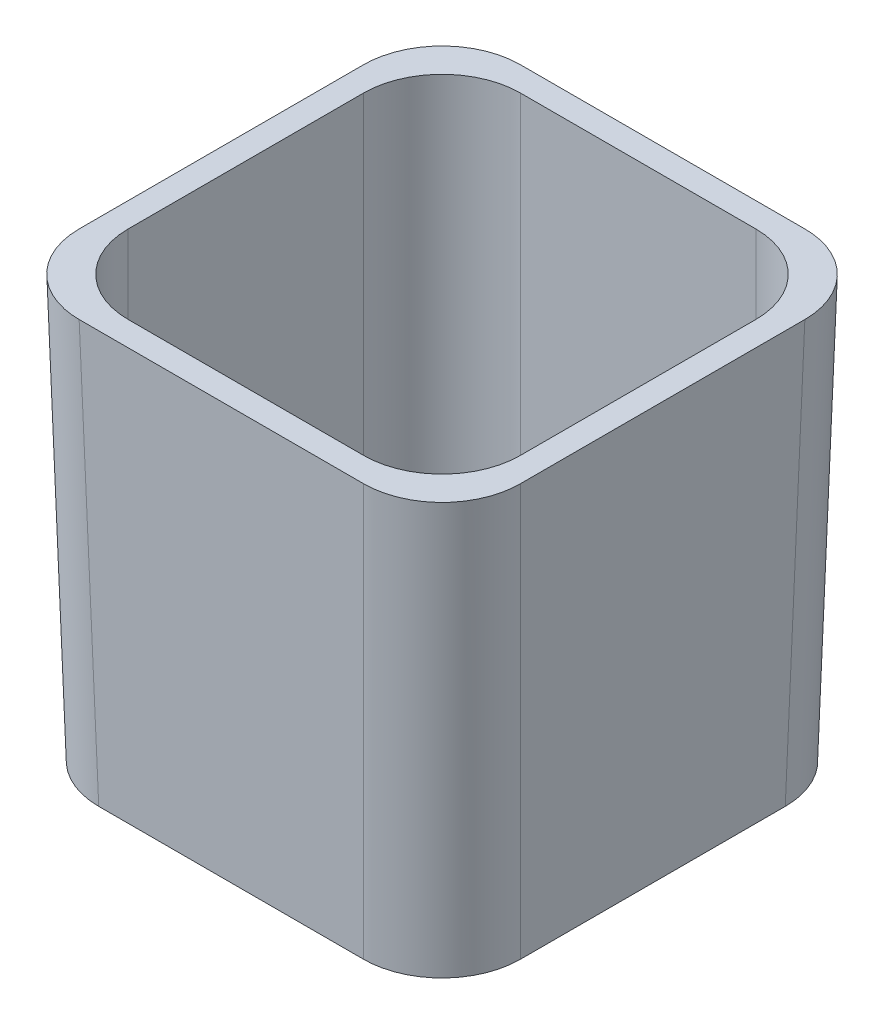
ISO-10303-21;
HEADER;
FILE_DESCRIPTION(('STEP AP214'),'2;1');
FILE_NAME('part.step','',(''),(''),'','','');
FILE_SCHEMA(('AUTOMOTIVE_DESIGN { 1 0 10303 214 1 1 1 1 }'));
ENDSEC;
DATA;
#1=APPLICATION_CONTEXT('core data for automotive mechanical design processes');
#2=APPLICATION_PROTOCOL_DEFINITION('international standard','automotive_design',2000,#1);
#3=PRODUCT_CONTEXT('',#1,'mechanical');
#4=PRODUCT('Part','Part','',(#3));
#5=PRODUCT_RELATED_PRODUCT_CATEGORY('part','',(#4));
#6=PRODUCT_DEFINITION_FORMATION('','',#4);
#7=PRODUCT_DEFINITION_CONTEXT('part definition',#1,'design');
#8=PRODUCT_DEFINITION('design','',#6,#7);
#9=PRODUCT_DEFINITION_SHAPE('','',#8);
#10=(LENGTH_UNIT() NAMED_UNIT(*) SI_UNIT(.MILLI.,.METRE.));
#11=(NAMED_UNIT(*) PLANE_ANGLE_UNIT() SI_UNIT($,.RADIAN.));
#12=(NAMED_UNIT(*) SI_UNIT($,.STERADIAN.) SOLID_ANGLE_UNIT());
#13=UNCERTAINTY_MEASURE_WITH_UNIT(LENGTH_MEASURE(1.E-05),#10,'distance_accuracy_value','');
#14=(GEOMETRIC_REPRESENTATION_CONTEXT(3) GLOBAL_UNCERTAINTY_ASSIGNED_CONTEXT((#13)) GLOBAL_UNIT_ASSIGNED_CONTEXT((#10,
#11,#12)) REPRESENTATION_CONTEXT('',''));
#15=CARTESIAN_POINT('',(0.,0.,0.));
#16=DIRECTION('',(0.,0.,1.));
#17=DIRECTION('',(1.,0.,0.));
#18=AXIS2_PLACEMENT_3D('',#15,#16,#17);
#19=CARTESIAN_POINT('',(0.,0.,0.));
#20=DIRECTION('',(0.,-1.,0.));
#21=DIRECTION('',(0.,0.,-1.));
#22=AXIS2_PLACEMENT_3D('',#19,#20,#21);
#23=PLANE('',#22);
#24=DIRECTION('',(-1.,0.,0.));
#25=VECTOR('',#24,1.);
#26=CARTESIAN_POINT('',(0.,0.,-86.));
#27=LINE('',#26,#25);
#28=CARTESIAN_POINT('',(70.0043249088505,0.,-86.));
#29=VERTEX_POINT('',#28);
#30=CARTESIAN_POINT('',(15.9956750911495,0.,-86.));
#31=VERTEX_POINT('',#30);
#32=EDGE_CURVE('E195',#29,#31,#27,.T.);
#33=ORIENTED_EDGE('',*,*,#32,.F.);
#34=CARTESIAN_POINT('',(69.9956739217812,0.,-69.9956739217811));
#35=DIRECTION('',(0.,-1.,0.));
#36=DIRECTION('',(-0.707106781186552,0.,0.707106781186543));
#37=AXIS2_PLACEMENT_3D('',#34,#35,#36);
#38=ELLIPSE('',#37,16.0086509873853,16.);
#39=CARTESIAN_POINT('',(86.,0.,-70.0043249088505));
#40=VERTEX_POINT('',#39);
#41=EDGE_CURVE('E177',#29,#40,#38,.T.);
#42=ORIENTED_EDGE('',*,*,#41,.T.);
#43=DIRECTION('',(0.,0.,-1.));
#44=VECTOR('',#43,1.);
#45=CARTESIAN_POINT('',(86.,0.,0.));
#46=LINE('',#45,#44);
#47=CARTESIAN_POINT('',(86.,0.,-15.9956750911495));
#48=VERTEX_POINT('',#47);
#49=EDGE_CURVE('E208',#48,#40,#46,.T.);
#50=ORIENTED_EDGE('',*,*,#49,.F.);
#51=CARTESIAN_POINT('',(69.9956739217812,0.,-16.0043260782188));
#52=DIRECTION('',(0.,-1.,0.));
#53=DIRECTION('',(-0.707106781186545,0.,-0.70710678118655));
#54=AXIS2_PLACEMENT_3D('',#51,#52,#53);
#55=ELLIPSE('',#54,16.0086509873853,16.);
#56=CARTESIAN_POINT('',(70.0043249088505,0.,0.));
#57=VERTEX_POINT('',#56);
#58=EDGE_CURVE('E189',#48,#57,#55,.T.);
#59=ORIENTED_EDGE('',*,*,#58,.T.);
#60=DIRECTION('',(1.,0.,0.));
#61=VECTOR('',#60,1.);
#62=CARTESIAN_POINT('',(0.,0.,0.));
#63=LINE('',#62,#61);
#64=CARTESIAN_POINT('',(15.9956750911495,0.,0.));
#65=VERTEX_POINT('',#64);
#66=EDGE_CURVE('E265',#65,#57,#63,.T.);
#67=ORIENTED_EDGE('',*,*,#66,.F.);
#68=CARTESIAN_POINT('',(16.0043260782188,0.,-16.0043260782188));
#69=DIRECTION('',(0.,-1.,0.));
#70=DIRECTION('',(0.707106781186542,0.,-0.707106781186553));
#71=AXIS2_PLACEMENT_3D('',#68,#69,#70);
#72=ELLIPSE('',#71,16.0086509873853,16.);
#73=CARTESIAN_POINT('',(0.,0.,-15.9956750911495));
#74=VERTEX_POINT('',#73);
#75=EDGE_CURVE('E530',#65,#74,#72,.T.);
#76=ORIENTED_EDGE('',*,*,#75,.T.);
#77=DIRECTION('',(0.,0.,1.));
#78=VECTOR('',#77,1.);
#79=CARTESIAN_POINT('',(0.,0.,0.));
#80=LINE('',#79,#78);
#81=CARTESIAN_POINT('',(0.,0.,-70.0043249088505));
#82=VERTEX_POINT('',#81);
#83=EDGE_CURVE('E209',#82,#74,#80,.T.);
#84=ORIENTED_EDGE('',*,*,#83,.F.);
#85=CARTESIAN_POINT('',(16.0043260782188,0.,-69.9956739217812));
#86=DIRECTION('',(0.,-1.,0.));
#87=DIRECTION('',(0.707106781186549,0.,0.707106781186546));
#88=AXIS2_PLACEMENT_3D('',#85,#86,#87);
#89=ELLIPSE('',#88,16.0086509873853,16.);
#90=EDGE_CURVE('E202',#82,#31,#89,.T.);
#91=ORIENTED_EDGE('',*,*,#90,.T.);
#92=EDGE_LOOP('',(#33,#42,#50,#59,#67,#76,#84,#91));
#93=FACE_BOUND('',#92,.T.);
#94=ADVANCED_FACE('F59',(#93),#23,.T.);
#95=CARTESIAN_POINT('',(0.,86.,0.));
#96=DIRECTION('',(0.,1.,0.));
#97=DIRECTION('',(0.,0.,1.));
#98=AXIS2_PLACEMENT_3D('',#95,#96,#97);
#99=PLANE('',#98);
#100=DIRECTION('',(-1.,0.,0.));
#101=VECTOR('',#100,1.);
#102=CARTESIAN_POINT('',(83.,86.,-83.));
#103=LINE('',#102,#101);
#104=CARTESIAN_POINT('',(67.,86.,-83.));
#105=VERTEX_POINT('',#104);
#106=CARTESIAN_POINT('',(19.,86.,-83.));
#107=VERTEX_POINT('',#106);
#108=EDGE_CURVE('E404',#105,#107,#103,.T.);
#109=ORIENTED_EDGE('',*,*,#108,.F.);
#110=CARTESIAN_POINT('',(67.,86.,-67.));
#111=DIRECTION('',(0.,1.,0.));
#112=DIRECTION('',(0.,0.,1.));
#113=AXIS2_PLACEMENT_3D('',#110,#111,#112);
#114=CIRCLE('',#113,16.);
#115=CARTESIAN_POINT('',(83.,86.,-67.));
#116=VERTEX_POINT('',#115);
#117=EDGE_CURVE('E519',#105,#116,#114,.F.);
#118=ORIENTED_EDGE('',*,*,#117,.T.);
#119=DIRECTION('',(0.,0.,-1.));
#120=VECTOR('',#119,1.);
#121=CARTESIAN_POINT('',(83.,86.,-83.));
#122=LINE('',#121,#120);
#123=CARTESIAN_POINT('',(83.,86.,-19.));
#124=VERTEX_POINT('',#123);
#125=EDGE_CURVE('E415',#124,#116,#122,.T.);
#126=ORIENTED_EDGE('',*,*,#125,.F.);
#127=CARTESIAN_POINT('',(67.,86.,-19.));
#128=DIRECTION('',(0.,1.,0.));
#129=DIRECTION('',(0.,0.,1.));
#130=AXIS2_PLACEMENT_3D('',#127,#128,#129);
#131=CIRCLE('',#130,16.);
#132=CARTESIAN_POINT('',(67.,86.,-2.99999999999999));
#133=VERTEX_POINT('',#132);
#134=EDGE_CURVE('E522',#124,#133,#131,.F.);
#135=ORIENTED_EDGE('',*,*,#134,.T.);
#136=DIRECTION('',(1.,0.,0.));
#137=VECTOR('',#136,1.);
#138=CARTESIAN_POINT('',(83.,86.,-2.99999999999999));
#139=LINE('',#138,#137);
#140=CARTESIAN_POINT('',(19.,86.,-2.99999999999998));
#141=VERTEX_POINT('',#140);
#142=EDGE_CURVE('E412',#141,#133,#139,.T.);
#143=ORIENTED_EDGE('',*,*,#142,.F.);
#144=CARTESIAN_POINT('',(19.,86.,-19.));
#145=DIRECTION('',(0.,1.,0.));
#146=DIRECTION('',(0.,0.,1.));
#147=AXIS2_PLACEMENT_3D('',#144,#145,#146);
#148=CIRCLE('',#147,16.);
#149=CARTESIAN_POINT('',(2.99999999999999,86.,-19.));
#150=VERTEX_POINT('',#149);
#151=EDGE_CURVE('E70',#141,#150,#148,.F.);
#152=ORIENTED_EDGE('',*,*,#151,.T.);
#153=DIRECTION('',(0.,0.,1.));
#154=VECTOR('',#153,1.);
#155=CARTESIAN_POINT('',(2.99999999999999,86.,-83.));
#156=LINE('',#155,#154);
#157=CARTESIAN_POINT('',(2.99999999999999,86.,-67.));
#158=VERTEX_POINT('',#157);
#159=EDGE_CURVE('E408',#158,#150,#156,.T.);
#160=ORIENTED_EDGE('',*,*,#159,.F.);
#161=CARTESIAN_POINT('',(19.,86.,-67.));
#162=DIRECTION('',(0.,1.,0.));
#163=DIRECTION('',(0.,0.,1.));
#164=AXIS2_PLACEMENT_3D('',#161,#162,#163);
#165=CIRCLE('',#164,16.);
#166=EDGE_CURVE('E12',#158,#107,#165,.F.);
#167=ORIENTED_EDGE('',*,*,#166,.T.);
#168=EDGE_LOOP('',(#109,#118,#126,#135,#143,#152,#160,#167));
#169=FACE_BOUND('',#168,.T.);
#170=DIRECTION('',(0.,0.,-1.));
#171=VECTOR('',#170,1.);
#172=CARTESIAN_POINT('',(88.,86.,-88.));
#173=LINE('',#172,#171);
#174=CARTESIAN_POINT('',(88.,86.,-13.9956750911495));
#175=VERTEX_POINT('',#174);
#176=CARTESIAN_POINT('',(88.,86.,-72.0043249088504));
#177=VERTEX_POINT('',#176);
#178=EDGE_CURVE('E373',#175,#177,#173,.T.);
#179=ORIENTED_EDGE('',*,*,#178,.T.);
#180=CARTESIAN_POINT('',(71.9956739217812,86.,-71.9956739217811));
#181=DIRECTION('',(0.,1.,0.));
#182=DIRECTION('',(-0.707106781186552,0.,0.707106781186543));
#183=AXIS2_PLACEMENT_3D('',#180,#181,#182);
#184=ELLIPSE('',#183,16.0086509873853,16.);
#185=CARTESIAN_POINT('',(72.0043249088505,86.,-88.));
#186=VERTEX_POINT('',#185);
#187=EDGE_CURVE('E454',#177,#186,#184,.T.);
#188=ORIENTED_EDGE('',*,*,#187,.T.);
#189=DIRECTION('',(-1.,0.,0.));
#190=VECTOR('',#189,1.);
#191=CARTESIAN_POINT('',(88.,86.,-88.));
#192=LINE('',#191,#190);
#193=CARTESIAN_POINT('',(13.9956750911495,86.,-88.));
#194=VERTEX_POINT('',#193);
#195=EDGE_CURVE('E199',#186,#194,#192,.T.);
#196=ORIENTED_EDGE('',*,*,#195,.T.);
#197=CARTESIAN_POINT('',(14.0043260782188,86.,-71.9956739217812));
#198=DIRECTION('',(0.,1.,0.));
#199=DIRECTION('',(0.707106781186549,0.,0.707106781186546));
#200=AXIS2_PLACEMENT_3D('',#197,#198,#199);
#201=ELLIPSE('',#200,16.0086509873853,16.);
#202=CARTESIAN_POINT('',(-2.,86.,-72.0043249088505));
#203=VERTEX_POINT('',#202);
#204=EDGE_CURVE('E440',#194,#203,#201,.T.);
#205=ORIENTED_EDGE('',*,*,#204,.T.);
#206=DIRECTION('',(0.,0.,1.));
#207=VECTOR('',#206,1.);
#208=CARTESIAN_POINT('',(-2.,86.,-88.));
#209=LINE('',#208,#207);
#210=CARTESIAN_POINT('',(-2.,86.,-13.9956750911495));
#211=VERTEX_POINT('',#210);
#212=EDGE_CURVE('E63',#203,#211,#209,.T.);
#213=ORIENTED_EDGE('',*,*,#212,.T.);
#214=CARTESIAN_POINT('',(14.0043260782188,86.,-14.0043260782188));
#215=DIRECTION('',(0.,1.,0.));
#216=DIRECTION('',(0.707106781186542,0.,-0.707106781186553));
#217=AXIS2_PLACEMENT_3D('',#214,#215,#216);
#218=ELLIPSE('',#217,16.0086509873853,16.);
#219=CARTESIAN_POINT('',(13.9956750911495,86.,2.00000000000003));
#220=VERTEX_POINT('',#219);
#221=EDGE_CURVE('E443',#211,#220,#218,.T.);
#222=ORIENTED_EDGE('',*,*,#221,.T.);
#223=DIRECTION('',(1.,0.,0.));
#224=VECTOR('',#223,1.);
#225=CARTESIAN_POINT('',(88.,86.,2.00000000000003));
#226=LINE('',#225,#224);
#227=CARTESIAN_POINT('',(72.0043249088505,86.,2.00000000000003));
#228=VERTEX_POINT('',#227);
#229=EDGE_CURVE('E326',#220,#228,#226,.T.);
#230=ORIENTED_EDGE('',*,*,#229,.T.);
#231=CARTESIAN_POINT('',(71.9956739217812,86.,-14.0043260782188));
#232=DIRECTION('',(0.,1.,0.));
#233=DIRECTION('',(-0.707106781186545,0.,-0.70710678118655));
#234=AXIS2_PLACEMENT_3D('',#231,#232,#233);
#235=ELLIPSE('',#234,16.0086509873853,16.);
#236=EDGE_CURVE('E445',#228,#175,#235,.T.);
#237=ORIENTED_EDGE('',*,*,#236,.T.);
#238=EDGE_LOOP('',(#179,#188,#196,#205,#213,#222,#230,#237));
#239=FACE_BOUND('',#238,.T.);
#240=ADVANCED_FACE('F233',(#169,#239),#99,.T.);
#241=CARTESIAN_POINT('',(0.,-1.99891891891891,-85.9535135135135));
#242=DIRECTION('',(0.,-0.0232495277487637,-0.999729693196846));
#243=DIRECTION('',(0.,0.999729693196846,-0.0232495277487637));
#244=AXIS2_PLACEMENT_3D('',#241,#242,#243);
#245=PLANE('',#244);
#246=ORIENTED_EDGE('',*,*,#195,.F.);
#247=DIRECTION('',(-0.023243246638897,-0.999459605472561,0.0232432466388966));
#248=VECTOR('',#247,1.);
#249=CARTESIAN_POINT('',(69.9200438040915,-3.62408750463564,-85.915718895241));
#250=LINE('',#249,#248);
#251=EDGE_CURVE('E181',#186,#29,#250,.T.);
#252=ORIENTED_EDGE('',*,*,#251,.T.);
#253=ORIENTED_EDGE('',*,*,#32,.T.);
#254=DIRECTION('',(0.0232432466388968,-0.999459605472561,0.0232432466388966));
#255=VECTOR('',#254,1.);
#256=CARTESIAN_POINT('',(16.0334948236773,-1.62624849869289,-85.9621802674722));
#257=LINE('',#256,#255);
#258=EDGE_CURVE('E203',#31,#194,#257,.F.);
#259=ORIENTED_EDGE('',*,*,#258,.T.);
#260=EDGE_LOOP('',(#246,#252,#253,#259));
#261=FACE_BOUND('',#260,.T.);
#262=ADVANCED_FACE('F194',(#261),#245,.T.);
#263=CARTESIAN_POINT('',(0.,0.,0.));
#264=DIRECTION('',(-0.999729693196846,-0.0232495277487638,0.));
#265=DIRECTION('',(0.0232495277487638,-0.999729693196846,0.));
#266=AXIS2_PLACEMENT_3D('',#263,#264,#265);
#267=PLANE('',#266);
#268=ORIENTED_EDGE('',*,*,#83,.T.);
#269=DIRECTION('',(0.0232432466388967,-0.999459605472561,-0.0232432466388971));
#270=VECTOR('',#269,1.);
#271=CARTESIAN_POINT('',(-0.00864163970348447,0.371590507249833,-15.987033451446));
#272=LINE('',#271,#270);
#273=EDGE_CURVE('E505',#74,#211,#272,.F.);
#274=ORIENTED_EDGE('',*,*,#273,.T.);
#275=ORIENTED_EDGE('',*,*,#212,.F.);
#276=DIRECTION('',(0.0232432466388967,-0.999459605472561,0.0232432466388966));
#277=VECTOR('',#276,1.);
#278=CARTESIAN_POINT('',(0.0378197325277418,-1.6262484986929,-69.9665051763227));
#279=LINE('',#278,#277);
#280=EDGE_CURVE('E502',#203,#82,#279,.T.);
#281=ORIENTED_EDGE('',*,*,#280,.T.);
#282=EDGE_LOOP('',(#268,#274,#275,#281));
#283=FACE_BOUND('',#282,.T.);
#284=ADVANCED_FACE('F287',(#283),#267,.T.);
#285=CARTESIAN_POINT('',(85.9535135135135,-1.99891891891893,0.));
#286=DIRECTION('',(0.999729693196846,-0.023249527748764,0.));
#287=DIRECTION('',(0.023249527748764,0.999729693196846,0.));
#288=AXIS2_PLACEMENT_3D('',#285,#286,#287);
#289=PLANE('',#288);
#290=ORIENTED_EDGE('',*,*,#49,.T.);
#291=DIRECTION('',(-0.0232432466388969,-0.999459605472561,0.0232432466388966));
#292=VECTOR('',#291,1.);
#293=CARTESIAN_POINT('',(85.915718895241,-3.62408750463565,-69.9200438040915));
#294=LINE('',#293,#292);
#295=EDGE_CURVE('E182',#40,#177,#294,.F.);
#296=ORIENTED_EDGE('',*,*,#295,.T.);
#297=ORIENTED_EDGE('',*,*,#178,.F.);
#298=DIRECTION('',(-0.0232432466388969,-0.999459605472561,-0.0232432466388971));
#299=VECTOR('',#298,1.);
#300=CARTESIAN_POINT('',(85.9621802674722,-1.62624849869292,-16.0334948236773));
#301=LINE('',#300,#299);
#302=EDGE_CURVE('E188',#175,#48,#301,.T.);
#303=ORIENTED_EDGE('',*,*,#302,.T.);
#304=EDGE_LOOP('',(#290,#296,#297,#303));
#305=FACE_BOUND('',#304,.T.);
#306=ADVANCED_FACE('F295',(#305),#289,.T.);
#307=CARTESIAN_POINT('',(0.,0.,0.));
#308=DIRECTION('',(0.,-0.0232495277487642,0.999729693196846));
#309=DIRECTION('',(0.,-0.999729693196846,-0.0232495277487642));
#310=AXIS2_PLACEMENT_3D('',#307,#308,#309);
#311=PLANE('',#310);
#312=ORIENTED_EDGE('',*,*,#66,.T.);
#313=DIRECTION('',(-0.023243246638897,-0.999459605472561,-0.0232432466388971));
#314=VECTOR('',#313,1.);
#315=CARTESIAN_POINT('',(69.9665051763227,-1.62624849869292,-0.0378197325277429));
#316=LINE('',#315,#314);
#317=EDGE_CURVE('E489',#57,#228,#316,.F.);
#318=ORIENTED_EDGE('',*,*,#317,.T.);
#319=ORIENTED_EDGE('',*,*,#229,.F.);
#320=DIRECTION('',(0.0232432466388968,-0.999459605472561,-0.0232432466388971));
#321=VECTOR('',#320,1.);
#322=CARTESIAN_POINT('',(15.987033451446,0.371590507249827,0.00864163970348448));
#323=LINE('',#322,#321);
#324=EDGE_CURVE('E486',#220,#65,#323,.T.);
#325=ORIENTED_EDGE('',*,*,#324,.T.);
#326=EDGE_LOOP('',(#312,#318,#319,#325));
#327=FACE_BOUND('',#326,.T.);
#328=ADVANCED_FACE('F234',(#327),#311,.T.);
#329=CARTESIAN_POINT('',(83.,4.99999999999999,-83.));
#330=DIRECTION('',(0.,0.,-1.));
#331=DIRECTION('',(-1.,0.,0.));
#332=AXIS2_PLACEMENT_3D('',#329,#330,#331);
#333=PLANE('',#332);
#334=DIRECTION('',(-1.,0.,0.));
#335=VECTOR('',#334,1.);
#336=CARTESIAN_POINT('',(83.,4.99999999999999,-83.));
#337=LINE('',#336,#335);
#338=CARTESIAN_POINT('',(67.,4.99999999999999,-83.));
#339=VERTEX_POINT('',#338);
#340=CARTESIAN_POINT('',(19.,4.99999999999999,-83.));
#341=VERTEX_POINT('',#340);
#342=EDGE_CURVE('E418',#339,#341,#337,.T.);
#343=ORIENTED_EDGE('',*,*,#342,.F.);
#344=DIRECTION('',(0.,1.,0.));
#345=VECTOR('',#344,1.);
#346=CARTESIAN_POINT('',(67.,86.,-83.));
#347=LINE('',#346,#345);
#348=EDGE_CURVE('E464',#339,#105,#347,.T.);
#349=ORIENTED_EDGE('',*,*,#348,.T.);
#350=ORIENTED_EDGE('',*,*,#108,.T.);
#351=DIRECTION('',(0.,1.,0.));
#352=VECTOR('',#351,1.);
#353=CARTESIAN_POINT('',(19.,4.99999999999999,-83.));
#354=LINE('',#353,#352);
#355=EDGE_CURVE('E459',#107,#341,#354,.F.);
#356=ORIENTED_EDGE('',*,*,#355,.T.);
#357=EDGE_LOOP('',(#343,#349,#350,#356));
#358=FACE_BOUND('',#357,.T.);
#359=ADVANCED_FACE('F344',(#358),#333,.F.);
#360=CARTESIAN_POINT('',(83.,4.99999999999999,-83.));
#361=DIRECTION('',(1.,0.,0.));
#362=DIRECTION('',(0.,0.,-1.));
#363=AXIS2_PLACEMENT_3D('',#360,#361,#362);
#364=PLANE('',#363);
#365=ORIENTED_EDGE('',*,*,#125,.T.);
#366=DIRECTION('',(0.,1.,0.));
#367=VECTOR('',#366,1.);
#368=CARTESIAN_POINT('',(83.,4.99999999999999,-67.));
#369=LINE('',#368,#367);
#370=CARTESIAN_POINT('',(83.,4.99999999999999,-67.));
#371=VERTEX_POINT('',#370);
#372=EDGE_CURVE('E472',#116,#371,#369,.F.);
#373=ORIENTED_EDGE('',*,*,#372,.T.);
#374=DIRECTION('',(0.,0.,-1.));
#375=VECTOR('',#374,1.);
#376=CARTESIAN_POINT('',(83.,4.99999999999999,-83.));
#377=LINE('',#376,#375);
#378=CARTESIAN_POINT('',(83.,4.99999999999999,-19.));
#379=VERTEX_POINT('',#378);
#380=EDGE_CURVE('E390',#379,#371,#377,.T.);
#381=ORIENTED_EDGE('',*,*,#380,.F.);
#382=DIRECTION('',(0.,1.,0.));
#383=VECTOR('',#382,1.);
#384=CARTESIAN_POINT('',(83.,86.,-19.));
#385=LINE('',#384,#383);
#386=EDGE_CURVE('E468',#379,#124,#385,.T.);
#387=ORIENTED_EDGE('',*,*,#386,.T.);
#388=EDGE_LOOP('',(#365,#373,#381,#387));
#389=FACE_BOUND('',#388,.T.);
#390=ADVANCED_FACE('F558',(#389),#364,.F.);
#391=CARTESIAN_POINT('',(83.,4.99999999999999,-2.99999999999999));
#392=DIRECTION('',(0.,0.,1.));
#393=DIRECTION('',(1.,0.,0.));
#394=AXIS2_PLACEMENT_3D('',#391,#392,#393);
#395=PLANE('',#394);
#396=ORIENTED_EDGE('',*,*,#142,.T.);
#397=DIRECTION('',(0.,1.,0.));
#398=VECTOR('',#397,1.);
#399=CARTESIAN_POINT('',(67.,4.99999999999999,-2.99999999999999));
#400=LINE('',#399,#398);
#401=CARTESIAN_POINT('',(67.,4.99999999999999,-2.99999999999999));
#402=VERTEX_POINT('',#401);
#403=EDGE_CURVE('E78',#133,#402,#400,.F.);
#404=ORIENTED_EDGE('',*,*,#403,.T.);
#405=DIRECTION('',(1.,0.,0.));
#406=VECTOR('',#405,1.);
#407=CARTESIAN_POINT('',(83.,4.99999999999999,-2.99999999999999));
#408=LINE('',#407,#406);
#409=CARTESIAN_POINT('',(19.,4.99999999999999,-2.99999999999998));
#410=VERTEX_POINT('',#409);
#411=EDGE_CURVE('E395',#410,#402,#408,.T.);
#412=ORIENTED_EDGE('',*,*,#411,.F.);
#413=DIRECTION('',(0.,1.,0.));
#414=VECTOR('',#413,1.);
#415=CARTESIAN_POINT('',(19.,86.,-2.99999999999998));
#416=LINE('',#415,#414);
#417=EDGE_CURVE('E494',#410,#141,#416,.T.);
#418=ORIENTED_EDGE('',*,*,#417,.T.);
#419=EDGE_LOOP('',(#396,#404,#412,#418));
#420=FACE_BOUND('',#419,.T.);
#421=ADVANCED_FACE('F605',(#420),#395,.F.);
#422=CARTESIAN_POINT('',(2.99999999999999,4.99999999999999,-83.));
#423=DIRECTION('',(-1.,0.,0.));
#424=DIRECTION('',(0.,0.,1.));
#425=AXIS2_PLACEMENT_3D('',#422,#423,#424);
#426=PLANE('',#425);
#427=ORIENTED_EDGE('',*,*,#159,.T.);
#428=DIRECTION('',(0.,1.,0.));
#429=VECTOR('',#428,1.);
#430=CARTESIAN_POINT('',(2.99999999999999,4.99999999999999,-19.));
#431=LINE('',#430,#429);
#432=CARTESIAN_POINT('',(2.99999999999999,4.99999999999999,-19.));
#433=VERTEX_POINT('',#432);
#434=EDGE_CURVE('E516',#150,#433,#431,.F.);
#435=ORIENTED_EDGE('',*,*,#434,.T.);
#436=DIRECTION('',(0.,0.,1.));
#437=VECTOR('',#436,1.);
#438=CARTESIAN_POINT('',(2.99999999999999,4.99999999999999,-83.));
#439=LINE('',#438,#437);
#440=CARTESIAN_POINT('',(2.99999999999999,4.99999999999999,-67.));
#441=VERTEX_POINT('',#440);
#442=EDGE_CURVE('E400',#441,#433,#439,.T.);
#443=ORIENTED_EDGE('',*,*,#442,.F.);
#444=DIRECTION('',(0.,1.,0.));
#445=VECTOR('',#444,1.);
#446=CARTESIAN_POINT('',(2.99999999999999,86.,-67.));
#447=LINE('',#446,#445);
#448=EDGE_CURVE('E510',#441,#158,#447,.T.);
#449=ORIENTED_EDGE('',*,*,#448,.T.);
#450=EDGE_LOOP('',(#427,#435,#443,#449));
#451=FACE_BOUND('',#450,.T.);
#452=ADVANCED_FACE('F614',(#451),#426,.F.);
#453=CARTESIAN_POINT('',(0.,4.99999999999999,0.));
#454=DIRECTION('',(0.,1.,0.));
#455=DIRECTION('',(0.,0.,1.));
#456=AXIS2_PLACEMENT_3D('',#453,#454,#455);
#457=PLANE('',#456);
#458=ORIENTED_EDGE('',*,*,#380,.T.);
#459=CARTESIAN_POINT('',(67.,4.99999999999999,-67.));
#460=DIRECTION('',(0.,1.,0.));
#461=DIRECTION('',(0.,0.,1.));
#462=AXIS2_PLACEMENT_3D('',#459,#460,#461);
#463=CIRCLE('',#462,16.);
#464=EDGE_CURVE('E483',#371,#339,#463,.T.);
#465=ORIENTED_EDGE('',*,*,#464,.T.);
#466=ORIENTED_EDGE('',*,*,#342,.T.);
#467=CARTESIAN_POINT('',(19.,4.99999999999999,-67.));
#468=DIRECTION('',(0.,1.,0.));
#469=DIRECTION('',(0.,0.,1.));
#470=AXIS2_PLACEMENT_3D('',#467,#468,#469);
#471=CIRCLE('',#470,16.);
#472=EDGE_CURVE('E475',#341,#441,#471,.T.);
#473=ORIENTED_EDGE('',*,*,#472,.T.);
#474=ORIENTED_EDGE('',*,*,#442,.T.);
#475=CARTESIAN_POINT('',(19.,4.99999999999999,-19.));
#476=DIRECTION('',(0.,1.,0.));
#477=DIRECTION('',(0.,0.,1.));
#478=AXIS2_PLACEMENT_3D('',#475,#476,#477);
#479=CIRCLE('',#478,16.);
#480=EDGE_CURVE('E85',#433,#410,#479,.T.);
#481=ORIENTED_EDGE('',*,*,#480,.T.);
#482=ORIENTED_EDGE('',*,*,#411,.T.);
#483=CARTESIAN_POINT('',(67.,4.99999999999999,-19.));
#484=DIRECTION('',(0.,1.,0.));
#485=DIRECTION('',(0.,0.,1.));
#486=AXIS2_PLACEMENT_3D('',#483,#484,#485);
#487=CIRCLE('',#486,16.);
#488=EDGE_CURVE('E480',#402,#379,#487,.T.);
#489=ORIENTED_EDGE('',*,*,#488,.T.);
#490=EDGE_LOOP('',(#458,#465,#466,#473,#474,#481,#482,#489));
#491=FACE_BOUND('',#490,.T.);
#492=ADVANCED_FACE('F622',(#491),#457,.T.);
#493=CARTESIAN_POINT('',(69.9200438040915,-3.25209506065542,-69.9200438040915));
#494=DIRECTION('',(-0.0232432466388969,-0.999459605472561,0.0232432466388966));
#495=DIRECTION('',(0.999729693196846,-0.023249527748764,0.));
#496=AXIS2_PLACEMENT_3D('',#493,#494,#495);
#497=CYLINDRICAL_SURFACE('',#496,16.);
#498=ORIENTED_EDGE('',*,*,#187,.F.);
#499=ORIENTED_EDGE('',*,*,#295,.F.);
#500=ORIENTED_EDGE('',*,*,#41,.F.);
#501=ORIENTED_EDGE('',*,*,#251,.F.);
#502=EDGE_LOOP('',(#498,#499,#500,#501));
#503=FACE_BOUND('',#502,.T.);
#504=ADVANCED_FACE('F180',(#503),#497,.T.);
#505=CARTESIAN_POINT('',(67.,4.99999999999999,-67.));
#506=DIRECTION('',(0.,-1.,0.));
#507=DIRECTION('',(0.,0.,-1.));
#508=AXIS2_PLACEMENT_3D('',#505,#506,#507);
#509=CYLINDRICAL_SURFACE('',#508,16.);
#510=ORIENTED_EDGE('',*,*,#464,.F.);
#511=ORIENTED_EDGE('',*,*,#372,.F.);
#512=ORIENTED_EDGE('',*,*,#117,.F.);
#513=ORIENTED_EDGE('',*,*,#348,.F.);
#514=EDGE_LOOP('',(#510,#511,#512,#513));
#515=FACE_BOUND('',#514,.T.);
#516=ADVANCED_FACE('F637',(#515),#509,.F.);
#517=CARTESIAN_POINT('',(69.9665051763227,-1.25425605471269,-16.0334948236773));
#518=DIRECTION('',(-0.0232432466388969,-0.999459605472561,-0.0232432466388971));
#519=DIRECTION('',(0.,0.0232495277487642,-0.999729693196846));
#520=AXIS2_PLACEMENT_3D('',#517,#518,#519);
#521=CYLINDRICAL_SURFACE('',#520,16.);
#522=ORIENTED_EDGE('',*,*,#236,.F.);
#523=ORIENTED_EDGE('',*,*,#317,.F.);
#524=ORIENTED_EDGE('',*,*,#58,.F.);
#525=ORIENTED_EDGE('',*,*,#302,.F.);
#526=EDGE_LOOP('',(#522,#523,#524,#525));
#527=FACE_BOUND('',#526,.T.);
#528=ADVANCED_FACE('F528',(#527),#521,.T.);
#529=CARTESIAN_POINT('',(67.,4.99999999999999,-19.));
#530=DIRECTION('',(0.,-1.,0.));
#531=DIRECTION('',(0.,0.,-1.));
#532=AXIS2_PLACEMENT_3D('',#529,#530,#531);
#533=CYLINDRICAL_SURFACE('',#532,16.);
#534=ORIENTED_EDGE('',*,*,#488,.F.);
#535=ORIENTED_EDGE('',*,*,#403,.F.);
#536=ORIENTED_EDGE('',*,*,#134,.F.);
#537=ORIENTED_EDGE('',*,*,#386,.F.);
#538=EDGE_LOOP('',(#534,#535,#536,#537));
#539=FACE_BOUND('',#538,.T.);
#540=ADVANCED_FACE('F651',(#539),#533,.F.);
#541=CARTESIAN_POINT('',(15.987033451446,0.743582951230054,-15.987033451446));
#542=DIRECTION('',(0.0232432466388967,-0.999459605472561,-0.0232432466388971));
#543=DIRECTION('',(0.,0.0232495277487642,-0.999729693196846));
#544=AXIS2_PLACEMENT_3D('',#541,#542,#543);
#545=CYLINDRICAL_SURFACE('',#544,16.);
#546=ORIENTED_EDGE('',*,*,#221,.F.);
#547=ORIENTED_EDGE('',*,*,#273,.F.);
#548=ORIENTED_EDGE('',*,*,#75,.F.);
#549=ORIENTED_EDGE('',*,*,#324,.F.);
#550=EDGE_LOOP('',(#546,#547,#548,#549));
#551=FACE_BOUND('',#550,.T.);
#552=ADVANCED_FACE('F552',(#551),#545,.T.);
#553=CARTESIAN_POINT('',(19.,4.99999999999999,-19.));
#554=DIRECTION('',(0.,-1.,0.));
#555=DIRECTION('',(0.,0.,-1.));
#556=AXIS2_PLACEMENT_3D('',#553,#554,#555);
#557=CYLINDRICAL_SURFACE('',#556,16.);
#558=ORIENTED_EDGE('',*,*,#480,.F.);
#559=ORIENTED_EDGE('',*,*,#434,.F.);
#560=ORIENTED_EDGE('',*,*,#151,.F.);
#561=ORIENTED_EDGE('',*,*,#417,.F.);
#562=EDGE_LOOP('',(#558,#559,#560,#561));
#563=FACE_BOUND('',#562,.T.);
#564=ADVANCED_FACE('F667',(#563),#557,.F.);
#565=CARTESIAN_POINT('',(16.0334948236773,-1.25425605471268,-69.9665051763227));
#566=DIRECTION('',(0.0232432466388967,-0.999459605472561,0.0232432466388966));
#567=DIRECTION('',(0.999729693196846,0.0232495277487638,0.));
#568=AXIS2_PLACEMENT_3D('',#565,#566,#567);
#569=CYLINDRICAL_SURFACE('',#568,16.);
#570=ORIENTED_EDGE('',*,*,#204,.F.);
#571=ORIENTED_EDGE('',*,*,#258,.F.);
#572=ORIENTED_EDGE('',*,*,#90,.F.);
#573=ORIENTED_EDGE('',*,*,#280,.F.);
#574=EDGE_LOOP('',(#570,#571,#572,#573));
#575=FACE_BOUND('',#574,.T.);
#576=ADVANCED_FACE('F675',(#575),#569,.T.);
#577=CARTESIAN_POINT('',(19.,4.99999999999999,-67.));
#578=DIRECTION('',(0.,-1.,0.));
#579=DIRECTION('',(0.,0.,-1.));
#580=AXIS2_PLACEMENT_3D('',#577,#578,#579);
#581=CYLINDRICAL_SURFACE('',#580,16.);
#582=ORIENTED_EDGE('',*,*,#472,.F.);
#583=ORIENTED_EDGE('',*,*,#355,.F.);
#584=ORIENTED_EDGE('',*,*,#166,.F.);
#585=ORIENTED_EDGE('',*,*,#448,.F.);
#586=EDGE_LOOP('',(#582,#583,#584,#585));
#587=FACE_BOUND('',#586,.T.);
#588=ADVANCED_FACE('F61',(#587),#581,.F.);
#589=CLOSED_SHELL('',(#94,#240,#262,#284,#306,#328,#359,#390,#421,#452,#492,#504,#516,#528,#540,
#552,#564,#576,#588));
#590=MANIFOLD_SOLID_BREP('B2',#589);
#591=ADVANCED_BREP_SHAPE_REPRESENTATION('',(#18,#590),#14);
#592=SHAPE_DEFINITION_REPRESENTATION(#9,#591);
ENDSEC;
END-ISO-10303-21;
